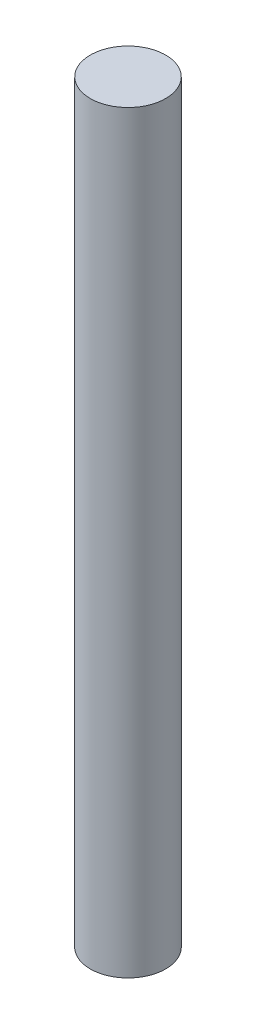
ISO-10303-21;
HEADER;
FILE_DESCRIPTION(('STEP AP214'),'2;1');
FILE_NAME('part.step','',(''),(''),'','','');
FILE_SCHEMA(('AUTOMOTIVE_DESIGN { 1 0 10303 214 1 1 1 1 }'));
ENDSEC;
DATA;
#1=APPLICATION_CONTEXT('core data for automotive mechanical design processes');
#2=APPLICATION_PROTOCOL_DEFINITION('international standard','automotive_design',2000,#1);
#3=PRODUCT_CONTEXT('',#1,'mechanical');
#4=PRODUCT('Part','Part','',(#3));
#5=PRODUCT_RELATED_PRODUCT_CATEGORY('part','',(#4));
#6=PRODUCT_DEFINITION_FORMATION('','',#4);
#7=PRODUCT_DEFINITION_CONTEXT('part definition',#1,'design');
#8=PRODUCT_DEFINITION('design','',#6,#7);
#9=PRODUCT_DEFINITION_SHAPE('','',#8);
#10=(LENGTH_UNIT() NAMED_UNIT(*) SI_UNIT(.MILLI.,.METRE.));
#11=(NAMED_UNIT(*) PLANE_ANGLE_UNIT() SI_UNIT($,.RADIAN.));
#12=(NAMED_UNIT(*) SI_UNIT($,.STERADIAN.) SOLID_ANGLE_UNIT());
#13=UNCERTAINTY_MEASURE_WITH_UNIT(LENGTH_MEASURE(1.E-05),#10,'distance_accuracy_value','');
#14=(GEOMETRIC_REPRESENTATION_CONTEXT(3) GLOBAL_UNCERTAINTY_ASSIGNED_CONTEXT((#13)) GLOBAL_UNIT_ASSIGNED_CONTEXT((#10,
#11,#12)) REPRESENTATION_CONTEXT('',''));
#15=CARTESIAN_POINT('',(0.,0.,0.));
#16=DIRECTION('',(0.,0.,1.));
#17=DIRECTION('',(1.,0.,0.));
#18=AXIS2_PLACEMENT_3D('',#15,#16,#17);
#19=CARTESIAN_POINT('',(-7.25012968294732,30.,-1.84325330922391));
#20=DIRECTION('',(0.,-1.,0.));
#21=DIRECTION('',(0.,0.,-1.));
#22=AXIS2_PLACEMENT_3D('',#19,#20,#21);
#23=CYLINDRICAL_SURFACE('',#22,1.5);
#24=CARTESIAN_POINT('',(-7.25012968294732,30.,-1.84325330922391));
#25=DIRECTION('',(0.,1.,0.));
#26=DIRECTION('',(0.,0.,1.));
#27=AXIS2_PLACEMENT_3D('',#24,#25,#26);
#28=CIRCLE('',#27,1.5);
#29=CARTESIAN_POINT('',(-7.25012968294732,30.,-0.343253309223914));
#30=VERTEX_POINT('',#29);
#31=EDGE_CURVE('E12',#30,#30,#28,.T.);
#32=ORIENTED_EDGE('',*,*,#31,.F.);
#33=EDGE_LOOP('',(#32));
#34=FACE_BOUND('',#33,.T.);
#35=CARTESIAN_POINT('',(-7.25012968294732,0.,-1.84325330922391));
#36=DIRECTION('',(0.,1.,0.));
#37=DIRECTION('',(0.,0.,1.));
#38=AXIS2_PLACEMENT_3D('',#35,#36,#37);
#39=CIRCLE('',#38,1.5);
#40=CARTESIAN_POINT('',(-7.25012968294732,0.,-0.343253309223914));
#41=VERTEX_POINT('',#40);
#42=EDGE_CURVE('E43',#41,#41,#39,.T.);
#43=ORIENTED_EDGE('',*,*,#42,.T.);
#44=EDGE_LOOP('',(#43));
#45=FACE_BOUND('',#44,.T.);
#46=ADVANCED_FACE('F40',(#34,#45),#23,.T.);
#47=CARTESIAN_POINT('',(-7.25012968294732,30.,-1.84325330922391));
#48=DIRECTION('',(0.,1.,0.));
#49=DIRECTION('',(0.,0.,1.));
#50=AXIS2_PLACEMENT_3D('',#47,#48,#49);
#51=PLANE('',#50);
#52=ORIENTED_EDGE('',*,*,#31,.T.);
#53=EDGE_LOOP('',(#52));
#54=FACE_BOUND('',#53,.T.);
#55=ADVANCED_FACE('F55',(#54),#51,.T.);
#56=CARTESIAN_POINT('',(-7.25012968294732,0.,-1.84325330922391));
#57=DIRECTION('',(0.,1.,0.));
#58=DIRECTION('',(0.,0.,1.));
#59=AXIS2_PLACEMENT_3D('',#56,#57,#58);
#60=PLANE('',#59);
#61=ORIENTED_EDGE('',*,*,#42,.F.);
#62=EDGE_LOOP('',(#61));
#63=FACE_BOUND('',#62,.T.);
#64=ADVANCED_FACE('F53',(#63),#60,.F.);
#65=CLOSED_SHELL('',(#46,#55,#64));
#66=MANIFOLD_SOLID_BREP('B2',#65);
#67=ADVANCED_BREP_SHAPE_REPRESENTATION('',(#18,#66),#14);
#68=SHAPE_DEFINITION_REPRESENTATION(#9,#67);
ENDSEC;
END-ISO-10303-21;
